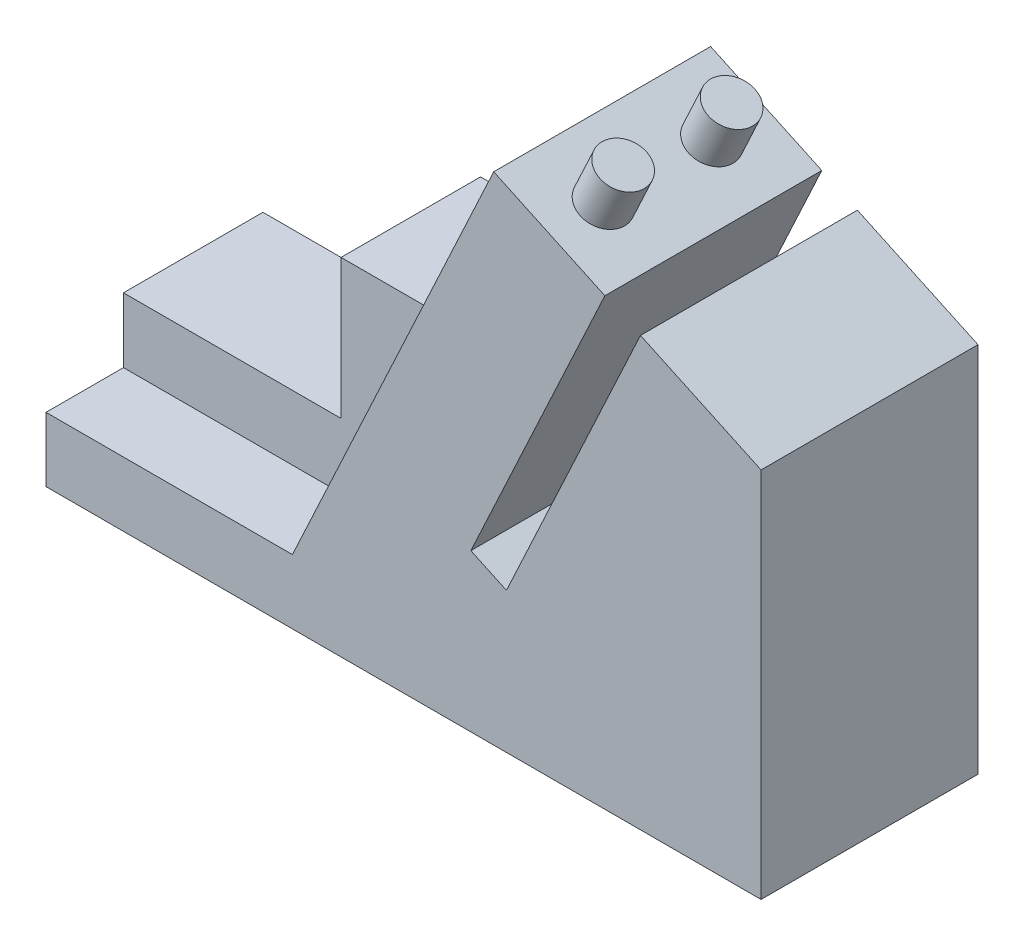
ISO-10303-21;
HEADER;
FILE_DESCRIPTION(('STEP AP214'),'2;1');
FILE_NAME('part.step','',(''),(''),'','','');
FILE_SCHEMA(('AUTOMOTIVE_DESIGN { 1 0 10303 214 1 1 1 1 }'));
ENDSEC;
DATA;
#1=APPLICATION_CONTEXT('core data for automotive mechanical design processes');
#2=APPLICATION_PROTOCOL_DEFINITION('international standard','automotive_design',2000,#1);
#3=PRODUCT_CONTEXT('',#1,'mechanical');
#4=PRODUCT('Part','Part','',(#3));
#5=PRODUCT_RELATED_PRODUCT_CATEGORY('part','',(#4));
#6=PRODUCT_DEFINITION_FORMATION('','',#4);
#7=PRODUCT_DEFINITION_CONTEXT('part definition',#1,'design');
#8=PRODUCT_DEFINITION('design','',#6,#7);
#9=PRODUCT_DEFINITION_SHAPE('','',#8);
#10=(LENGTH_UNIT() NAMED_UNIT(*) SI_UNIT(.MILLI.,.METRE.));
#11=(NAMED_UNIT(*) PLANE_ANGLE_UNIT() SI_UNIT($,.RADIAN.));
#12=(NAMED_UNIT(*) SI_UNIT($,.STERADIAN.) SOLID_ANGLE_UNIT());
#13=UNCERTAINTY_MEASURE_WITH_UNIT(LENGTH_MEASURE(1.E-05),#10,'distance_accuracy_value','');
#14=(GEOMETRIC_REPRESENTATION_CONTEXT(3) GLOBAL_UNCERTAINTY_ASSIGNED_CONTEXT((#13)) GLOBAL_UNIT_ASSIGNED_CONTEXT((#10,
#11,#12)) REPRESENTATION_CONTEXT('',''));
#15=CARTESIAN_POINT('',(0.,0.,0.));
#16=DIRECTION('',(0.,0.,1.));
#17=DIRECTION('',(1.,0.,0.));
#18=AXIS2_PLACEMENT_3D('',#15,#16,#17);
#19=CARTESIAN_POINT('',(-32008.7952704918,-8339.2597401296,28000.));
#20=DIRECTION('',(-1.,0.,0.));
#21=DIRECTION('',(0.,0.,1.));
#22=AXIS2_PLACEMENT_3D('',#19,#20,#21);
#23=PLANE('',#22);
#24=DIRECTION('',(0.,1.,0.));
#25=VECTOR('',#24,1.);
#26=CARTESIAN_POINT('',(-32008.7952704918,-8339.2597401296,0.));
#27=LINE('',#26,#25);
#28=CARTESIAN_POINT('',(-32008.7952704918,-8339.2597401296,0.));
#29=VERTEX_POINT('',#28);
#30=CARTESIAN_POINT('',(-32008.7952704918,8328.71220367922,0.));
#31=VERTEX_POINT('',#30);
#32=EDGE_CURVE('E183',#29,#31,#27,.T.);
#33=ORIENTED_EDGE('',*,*,#32,.F.);
#34=DIRECTION('',(0.,0.,-1.));
#35=VECTOR('',#34,1.);
#36=CARTESIAN_POINT('',(-32008.7952704918,-8339.2597401296,28000.));
#37=LINE('',#36,#35);
#38=CARTESIAN_POINT('',(-32008.7952704918,-8339.2597401296,28000.));
#39=VERTEX_POINT('',#38);
#40=EDGE_CURVE('E11',#39,#29,#37,.T.);
#41=ORIENTED_EDGE('',*,*,#40,.F.);
#42=DIRECTION('',(0.,1.,0.));
#43=VECTOR('',#42,1.);
#44=CARTESIAN_POINT('',(-32008.7952704918,-8339.2597401296,28000.));
#45=LINE('',#44,#43);
#46=CARTESIAN_POINT('',(-32008.7952704918,-32.960143442623,28000.));
#47=VERTEX_POINT('',#46);
#48=EDGE_CURVE('E188',#39,#47,#45,.T.);
#49=ORIENTED_EDGE('',*,*,#48,.T.);
#50=DIRECTION('',(0.,0.,-1.));
#51=VECTOR('',#50,1.);
#52=CARTESIAN_POINT('',(-32008.7952704918,-32.960143442623,28000.));
#53=LINE('',#52,#51);
#54=CARTESIAN_POINT('',(-32008.7952704918,-32.960143442623,18000.));
#55=VERTEX_POINT('',#54);
#56=EDGE_CURVE('E45',#47,#55,#53,.T.);
#57=ORIENTED_EDGE('',*,*,#56,.T.);
#58=DIRECTION('',(0.,-1.,0.));
#59=VECTOR('',#58,1.);
#60=CARTESIAN_POINT('',(-32008.7952704918,-32.960143442623,18000.));
#61=LINE('',#60,#59);
#62=CARTESIAN_POINT('',(-32008.7952704918,8328.71220367922,18000.));
#63=VERTEX_POINT('',#62);
#64=EDGE_CURVE('E154',#63,#55,#61,.T.);
#65=ORIENTED_EDGE('',*,*,#64,.F.);
#66=DIRECTION('',(0.,0.,-1.));
#67=VECTOR('',#66,1.);
#68=CARTESIAN_POINT('',(-32008.7952704918,8328.71220367922,18000.));
#69=LINE('',#68,#67);
#70=EDGE_CURVE('E173',#63,#31,#69,.T.);
#71=ORIENTED_EDGE('',*,*,#70,.T.);
#72=EDGE_LOOP('',(#33,#41,#49,#57,#65,#71));
#73=FACE_BOUND('',#72,.T.);
#74=ADVANCED_FACE('F39',(#73),#23,.T.);
#75=CARTESIAN_POINT('',(60289.5756714365,-8339.25974012959,28000.));
#76=DIRECTION('',(0.,-1.,0.));
#77=DIRECTION('',(1.,0.,0.));
#78=AXIS2_PLACEMENT_3D('',#75,#76,#77);
#79=PLANE('',#78);
#80=DIRECTION('',(-1.,0.,0.));
#81=VECTOR('',#80,1.);
#82=CARTESIAN_POINT('',(60289.5756714365,-8339.25974012959,0.));
#83=LINE('',#82,#81);
#84=CARTESIAN_POINT('',(60289.5756714365,-8339.25974012959,0.));
#85=VERTEX_POINT('',#84);
#86=EDGE_CURVE('E190',#85,#29,#83,.T.);
#87=ORIENTED_EDGE('',*,*,#86,.F.);
#88=DIRECTION('',(0.,0.,-1.));
#89=VECTOR('',#88,1.);
#90=CARTESIAN_POINT('',(60289.5756714365,-8339.25974012959,28000.));
#91=LINE('',#90,#89);
#92=CARTESIAN_POINT('',(60289.5756714365,-8339.25974012959,28000.));
#93=VERTEX_POINT('',#92);
#94=EDGE_CURVE('E50',#93,#85,#91,.T.);
#95=ORIENTED_EDGE('',*,*,#94,.F.);
#96=DIRECTION('',(-1.,0.,0.));
#97=VECTOR('',#96,1.);
#98=CARTESIAN_POINT('',(60289.5756714365,-8339.25974012959,28000.));
#99=LINE('',#98,#97);
#100=EDGE_CURVE('E211',#93,#39,#99,.T.);
#101=ORIENTED_EDGE('',*,*,#100,.T.);
#102=ORIENTED_EDGE('',*,*,#40,.T.);
#103=EDGE_LOOP('',(#87,#95,#101,#102));
#104=FACE_BOUND('',#103,.T.);
#105=ADVANCED_FACE('F299',(#104),#79,.T.);
#106=CARTESIAN_POINT('',(60289.5756714365,39678.8160946649,28000.));
#107=DIRECTION('',(1.,0.,0.));
#108=DIRECTION('',(0.,0.,-1.));
#109=AXIS2_PLACEMENT_3D('',#106,#107,#108);
#110=PLANE('',#109);
#111=DIRECTION('',(0.,-1.,0.));
#112=VECTOR('',#111,1.);
#113=CARTESIAN_POINT('',(60289.5756714365,39678.8160946649,0.));
#114=LINE('',#113,#112);
#115=CARTESIAN_POINT('',(60289.5756714365,39678.8160946649,0.));
#116=VERTEX_POINT('',#115);
#117=EDGE_CURVE('E235',#116,#85,#114,.T.);
#118=ORIENTED_EDGE('',*,*,#117,.F.);
#119=DIRECTION('',(0.,0.,-1.));
#120=VECTOR('',#119,1.);
#121=CARTESIAN_POINT('',(60289.5756714365,39678.8160946649,28000.));
#122=LINE('',#121,#120);
#123=CARTESIAN_POINT('',(60289.5756714365,39678.8160946649,28000.));
#124=VERTEX_POINT('',#123);
#125=EDGE_CURVE('E236',#124,#116,#122,.T.);
#126=ORIENTED_EDGE('',*,*,#125,.F.);
#127=DIRECTION('',(0.,-1.,0.));
#128=VECTOR('',#127,1.);
#129=CARTESIAN_POINT('',(60289.5756714365,39678.8160946649,28000.));
#130=LINE('',#129,#128);
#131=EDGE_CURVE('E208',#124,#93,#130,.T.);
#132=ORIENTED_EDGE('',*,*,#131,.T.);
#133=ORIENTED_EDGE('',*,*,#94,.T.);
#134=EDGE_LOOP('',(#118,#126,#132,#133));
#135=FACE_BOUND('',#134,.T.);
#136=ADVANCED_FACE('F294',(#135),#110,.T.);
#137=CARTESIAN_POINT('',(44721.8591466185,46929.5333801965,28000.));
#138=DIRECTION('',(0.422205539219614,0.906500128324467,0.));
#139=DIRECTION('',(-0.906500128324467,0.422205539219614,0.));
#140=AXIS2_PLACEMENT_3D('',#137,#138,#139);
#141=PLANE('',#140);
#142=DIRECTION('',(0.906500128324467,-0.422205539219614,0.));
#143=VECTOR('',#142,1.);
#144=CARTESIAN_POINT('',(44721.8591466185,46929.5333801965,0.));
#145=LINE('',#144,#143);
#146=CARTESIAN_POINT('',(44721.8591466185,46929.5333801965,0.));
#147=VERTEX_POINT('',#146);
#148=EDGE_CURVE('E230',#147,#116,#145,.T.);
#149=ORIENTED_EDGE('',*,*,#148,.F.);
#150=DIRECTION('',(0.,0.,-1.));
#151=VECTOR('',#150,1.);
#152=CARTESIAN_POINT('',(44721.8591466185,46929.5333801965,28000.));
#153=LINE('',#152,#151);
#154=CARTESIAN_POINT('',(44721.8591466185,46929.5333801965,28000.));
#155=VERTEX_POINT('',#154);
#156=EDGE_CURVE('E238',#155,#147,#153,.T.);
#157=ORIENTED_EDGE('',*,*,#156,.F.);
#158=DIRECTION('',(0.906500128324467,-0.422205539219614,0.));
#159=VECTOR('',#158,1.);
#160=CARTESIAN_POINT('',(44721.8591466185,46929.5333801965,28000.));
#161=LINE('',#160,#159);
#162=EDGE_CURVE('E202',#155,#124,#161,.T.);
#163=ORIENTED_EDGE('',*,*,#162,.T.);
#164=ORIENTED_EDGE('',*,*,#125,.T.);
#165=EDGE_LOOP('',(#149,#157,#163,#164));
#166=FACE_BOUND('',#165,.T.);
#167=ADVANCED_FACE('F288',(#166),#141,.T.);
#168=CARTESIAN_POINT('',(27422.0694741557,9785.86731873225,28000.));
#169=DIRECTION('',(-0.906500128324467,0.422205539219614,0.));
#170=DIRECTION('',(-0.422205539219614,-0.906500128324467,0.));
#171=AXIS2_PLACEMENT_3D('',#168,#169,#170);
#172=PLANE('',#171);
#173=DIRECTION('',(0.422205539219614,0.906500128324467,0.));
#174=VECTOR('',#173,1.);
#175=CARTESIAN_POINT('',(27422.0694741557,9785.86731873225,0.));
#176=LINE('',#175,#174);
#177=CARTESIAN_POINT('',(27422.0694741557,9785.86731873225,0.));
#178=VERTEX_POINT('',#177);
#179=EDGE_CURVE('E228',#178,#147,#176,.T.);
#180=ORIENTED_EDGE('',*,*,#179,.F.);
#181=DIRECTION('',(0.,0.,-1.));
#182=VECTOR('',#181,1.);
#183=CARTESIAN_POINT('',(27422.0694741557,9785.86731873225,28000.));
#184=LINE('',#183,#182);
#185=CARTESIAN_POINT('',(27422.0694741557,9785.86731873225,28000.));
#186=VERTEX_POINT('',#185);
#187=EDGE_CURVE('E244',#186,#178,#184,.T.);
#188=ORIENTED_EDGE('',*,*,#187,.F.);
#189=DIRECTION('',(0.422205539219614,0.906500128324467,0.));
#190=VECTOR('',#189,1.);
#191=CARTESIAN_POINT('',(27422.0694741557,9785.86731873225,28000.));
#192=LINE('',#191,#190);
#193=EDGE_CURVE('E205',#186,#155,#192,.T.);
#194=ORIENTED_EDGE('',*,*,#193,.T.);
#195=ORIENTED_EDGE('',*,*,#156,.T.);
#196=EDGE_LOOP('',(#180,#188,#194,#195));
#197=FACE_BOUND('',#196,.T.);
#198=ADVANCED_FACE('F290',(#197),#172,.T.);
#199=CARTESIAN_POINT('',(22828.6245587359,11925.2800190648,28000.));
#200=DIRECTION('',(0.422205539219615,0.906500128324467,0.));
#201=DIRECTION('',(-0.906500128324467,0.422205539219615,0.));
#202=AXIS2_PLACEMENT_3D('',#199,#200,#201);
#203=PLANE('',#202);
#204=DIRECTION('',(0.906500128324466,-0.422205539219615,0.));
#205=VECTOR('',#204,1.);
#206=CARTESIAN_POINT('',(22828.6245587359,11925.2800190648,0.));
#207=LINE('',#206,#205);
#208=CARTESIAN_POINT('',(22828.6245587359,11925.2800190648,0.));
#209=VERTEX_POINT('',#208);
#210=EDGE_CURVE('E224',#209,#178,#207,.T.);
#211=ORIENTED_EDGE('',*,*,#210,.F.);
#212=DIRECTION('',(0.,0.,-1.));
#213=VECTOR('',#212,1.);
#214=CARTESIAN_POINT('',(22828.6245587359,11925.2800190648,28000.));
#215=LINE('',#214,#213);
#216=CARTESIAN_POINT('',(22828.6245587359,11925.2800190648,28000.));
#217=VERTEX_POINT('',#216);
#218=EDGE_CURVE('E245',#217,#209,#215,.T.);
#219=ORIENTED_EDGE('',*,*,#218,.F.);
#220=DIRECTION('',(0.906500128324466,-0.422205539219615,0.));
#221=VECTOR('',#220,1.);
#222=CARTESIAN_POINT('',(22828.6245587359,11925.2800190648,28000.));
#223=LINE('',#222,#221);
#224=EDGE_CURVE('E200',#217,#186,#223,.T.);
#225=ORIENTED_EDGE('',*,*,#224,.T.);
#226=ORIENTED_EDGE('',*,*,#187,.T.);
#227=EDGE_LOOP('',(#211,#219,#225,#226));
#228=FACE_BOUND('',#227,.T.);
#229=ADVANCED_FACE('F282',(#228),#203,.T.);
#230=CARTESIAN_POINT('',(40128.4142311987,49068.946080529,28000.));
#231=DIRECTION('',(0.906500128324467,-0.422205539219615,0.));
#232=DIRECTION('',(0.422205539219615,0.906500128324467,0.));
#233=AXIS2_PLACEMENT_3D('',#230,#231,#232);
#234=PLANE('',#233);
#235=DIRECTION('',(-0.422205539219615,-0.906500128324466,0.));
#236=VECTOR('',#235,1.);
#237=CARTESIAN_POINT('',(40128.4142311987,49068.946080529,0.));
#238=LINE('',#237,#236);
#239=CARTESIAN_POINT('',(40128.4142311987,49068.946080529,0.));
#240=VERTEX_POINT('',#239);
#241=EDGE_CURVE('E219',#240,#209,#238,.T.);
#242=ORIENTED_EDGE('',*,*,#241,.F.);
#243=DIRECTION('',(0.,0.,-1.));
#244=VECTOR('',#243,1.);
#245=CARTESIAN_POINT('',(40128.4142311987,49068.946080529,28000.));
#246=LINE('',#245,#244);
#247=CARTESIAN_POINT('',(40128.4142311987,49068.946080529,28000.));
#248=VERTEX_POINT('',#247);
#249=EDGE_CURVE('E247',#248,#240,#246,.T.);
#250=ORIENTED_EDGE('',*,*,#249,.F.);
#251=DIRECTION('',(-0.422205539219615,-0.906500128324466,0.));
#252=VECTOR('',#251,1.);
#253=CARTESIAN_POINT('',(40128.4142311987,49068.946080529,28000.));
#254=LINE('',#253,#252);
#255=EDGE_CURVE('E198',#248,#217,#254,.T.);
#256=ORIENTED_EDGE('',*,*,#255,.T.);
#257=ORIENTED_EDGE('',*,*,#218,.T.);
#258=EDGE_LOOP('',(#242,#250,#256,#257));
#259=FACE_BOUND('',#258,.T.);
#260=ADVANCED_FACE('F278',(#259),#234,.T.);
#261=CARTESIAN_POINT('',(25778.6941642917,55752.3773445679,28000.));
#262=DIRECTION('',(0.422205539219614,0.906500128324467,0.));
#263=DIRECTION('',(-0.906500128324467,0.422205539219614,0.));
#264=AXIS2_PLACEMENT_3D('',#261,#262,#263);
#265=PLANE('',#264);
#266=CARTESIAN_POINT('',(32953.5541977452,52410.6617125485,21000.));
#267=DIRECTION('',(0.422205539219614,0.906500128324467,0.));
#268=DIRECTION('',(-0.906500128324467,0.422205539219614,0.));
#269=AXIS2_PLACEMENT_3D('',#266,#267,#268);
#270=CIRCLE('',#269,3000.);
#271=CARTESIAN_POINT('',(30234.0538127718,53677.2783302073,21000.));
#272=VERTEX_POINT('',#271);
#273=EDGE_CURVE('E351',#272,#272,#270,.T.);
#274=ORIENTED_EDGE('',*,*,#273,.F.);
#275=EDGE_LOOP('',(#274));
#276=FACE_BOUND('',#275,.T.);
#277=CARTESIAN_POINT('',(32953.5541977452,52410.6617125485,7000.));
#278=DIRECTION('',(0.422205539219614,0.906500128324467,0.));
#279=DIRECTION('',(-0.906500128324467,0.422205539219614,0.));
#280=AXIS2_PLACEMENT_3D('',#277,#278,#279);
#281=CIRCLE('',#280,3000.);
#282=CARTESIAN_POINT('',(30234.0538127718,53677.2783302073,7000.));
#283=VERTEX_POINT('',#282);
#284=EDGE_CURVE('E359',#283,#283,#281,.T.);
#285=ORIENTED_EDGE('',*,*,#284,.F.);
#286=EDGE_LOOP('',(#285));
#287=FACE_BOUND('',#286,.T.);
#288=DIRECTION('',(0.906500128324467,-0.422205539219614,0.));
#289=VECTOR('',#288,1.);
#290=CARTESIAN_POINT('',(25778.6941642917,55752.3773445679,0.));
#291=LINE('',#290,#289);
#292=CARTESIAN_POINT('',(25778.6941642917,55752.3773445679,0.));
#293=VERTEX_POINT('',#292);
#294=EDGE_CURVE('E220',#293,#240,#291,.T.);
#295=ORIENTED_EDGE('',*,*,#294,.F.);
#296=DIRECTION('',(0.,0.,-1.));
#297=VECTOR('',#296,1.);
#298=CARTESIAN_POINT('',(25778.6941642917,55752.3773445679,28000.));
#299=LINE('',#298,#297);
#300=CARTESIAN_POINT('',(25778.6941642917,55752.3773445679,28000.));
#301=VERTEX_POINT('',#300);
#302=EDGE_CURVE('E144',#301,#293,#299,.T.);
#303=ORIENTED_EDGE('',*,*,#302,.F.);
#304=DIRECTION('',(0.906500128324467,-0.422205539219614,0.));
#305=VECTOR('',#304,1.);
#306=CARTESIAN_POINT('',(25778.6941642917,55752.3773445679,28000.));
#307=LINE('',#306,#305);
#308=EDGE_CURVE('E194',#301,#248,#307,.T.);
#309=ORIENTED_EDGE('',*,*,#308,.T.);
#310=ORIENTED_EDGE('',*,*,#249,.T.);
#311=EDGE_LOOP('',(#295,#303,#309,#310));
#312=FACE_BOUND('',#311,.T.);
#313=ADVANCED_FACE('F252',(#276,#287,#312),#265,.T.);
#314=CARTESIAN_POINT('',(-203.51781642551,-32.960143442623,28000.));
#315=DIRECTION('',(-0.906500128324467,0.422205539219614,0.));
#316=DIRECTION('',(-0.422205539219614,-0.906500128324467,0.));
#317=AXIS2_PLACEMENT_3D('',#314,#315,#316);
#318=PLANE('',#317);
#319=DIRECTION('',(0.,0.,-1.));
#320=VECTOR('',#319,1.);
#321=CARTESIAN_POINT('',(12074.5213589463,26328.7122036792,18000.));
#322=LINE('',#321,#320);
#323=CARTESIAN_POINT('',(12074.5213589463,26328.7122036792,18000.));
#324=VERTEX_POINT('',#323);
#325=CARTESIAN_POINT('',(12074.5213589463,26328.7122036792,0.));
#326=VERTEX_POINT('',#325);
#327=EDGE_CURVE('E54',#324,#326,#322,.T.);
#328=ORIENTED_EDGE('',*,*,#327,.F.);
#329=DIRECTION('',(0.422205539219614,0.906500128324467,0.));
#330=VECTOR('',#329,1.);
#331=CARTESIAN_POINT('',(-203.51781642551,-32.960143442623,18000.));
#332=LINE('',#331,#330);
#333=CARTESIAN_POINT('',(-203.51781642551,-32.960143442623,18000.));
#334=VERTEX_POINT('',#333);
#335=EDGE_CURVE('E148',#334,#324,#332,.T.);
#336=ORIENTED_EDGE('',*,*,#335,.F.);
#337=DIRECTION('',(0.,0.,-1.));
#338=VECTOR('',#337,1.);
#339=CARTESIAN_POINT('',(-203.51781642551,-32.960143442623,28000.));
#340=LINE('',#339,#338);
#341=CARTESIAN_POINT('',(-203.51781642551,-32.960143442623,28000.));
#342=VERTEX_POINT('',#341);
#343=EDGE_CURVE('E136',#342,#334,#340,.T.);
#344=ORIENTED_EDGE('',*,*,#343,.F.);
#345=DIRECTION('',(0.422205539219614,0.906500128324467,0.));
#346=VECTOR('',#345,1.);
#347=CARTESIAN_POINT('',(-203.51781642551,-32.960143442623,28000.));
#348=LINE('',#347,#346);
#349=EDGE_CURVE('E192',#342,#301,#348,.T.);
#350=ORIENTED_EDGE('',*,*,#349,.T.);
#351=ORIENTED_EDGE('',*,*,#302,.T.);
#352=DIRECTION('',(0.422205539219614,0.906500128324467,0.));
#353=VECTOR('',#352,1.);
#354=CARTESIAN_POINT('',(-203.51781642551,-32.960143442623,0.));
#355=LINE('',#354,#353);
#356=EDGE_CURVE('E214',#326,#293,#355,.T.);
#357=ORIENTED_EDGE('',*,*,#356,.F.);
#358=EDGE_LOOP('',(#328,#336,#344,#350,#351,#357));
#359=FACE_BOUND('',#358,.T.);
#360=ADVANCED_FACE('F150',(#359),#318,.T.);
#361=CARTESIAN_POINT('',(-32008.7952704918,-32.960143442623,28000.));
#362=DIRECTION('',(0.,1.,0.));
#363=DIRECTION('',(0.,0.,1.));
#364=AXIS2_PLACEMENT_3D('',#361,#362,#363);
#365=PLANE('',#364);
#366=DIRECTION('',(1.,0.,0.));
#367=VECTOR('',#366,1.);
#368=CARTESIAN_POINT('',(-32008.7952704918,-32.960143442623,18000.));
#369=LINE('',#368,#367);
#370=EDGE_CURVE('E62',#55,#334,#369,.T.);
#371=ORIENTED_EDGE('',*,*,#370,.F.);
#372=ORIENTED_EDGE('',*,*,#56,.F.);
#373=DIRECTION('',(1.,0.,0.));
#374=VECTOR('',#373,1.);
#375=CARTESIAN_POINT('',(-32008.7952704918,-32.960143442623,28000.));
#376=LINE('',#375,#374);
#377=EDGE_CURVE('E142',#47,#342,#376,.T.);
#378=ORIENTED_EDGE('',*,*,#377,.T.);
#379=ORIENTED_EDGE('',*,*,#343,.T.);
#380=EDGE_LOOP('',(#371,#372,#378,#379));
#381=FACE_BOUND('',#380,.T.);
#382=ADVANCED_FACE('F138',(#381),#365,.T.);
#383=CARTESIAN_POINT('',(0.,0.,28000.));
#384=DIRECTION('',(0.,0.,-1.));
#385=DIRECTION('',(-1.,0.,0.));
#386=AXIS2_PLACEMENT_3D('',#383,#384,#385);
#387=PLANE('',#386);
#388=ORIENTED_EDGE('',*,*,#48,.F.);
#389=ORIENTED_EDGE('',*,*,#100,.F.);
#390=ORIENTED_EDGE('',*,*,#131,.F.);
#391=ORIENTED_EDGE('',*,*,#162,.F.);
#392=ORIENTED_EDGE('',*,*,#193,.F.);
#393=ORIENTED_EDGE('',*,*,#224,.F.);
#394=ORIENTED_EDGE('',*,*,#255,.F.);
#395=ORIENTED_EDGE('',*,*,#308,.F.);
#396=ORIENTED_EDGE('',*,*,#349,.F.);
#397=ORIENTED_EDGE('',*,*,#377,.F.);
#398=EDGE_LOOP('',(#388,#389,#390,#391,#392,#393,#394,#395,#396,#397));
#399=FACE_BOUND('',#398,.T.);
#400=ADVANCED_FACE('F273',(#399),#387,.F.);
#401=CARTESIAN_POINT('',(0.,0.,0.));
#402=DIRECTION('',(0.,0.,-1.));
#403=DIRECTION('',(-1.,0.,0.));
#404=AXIS2_PLACEMENT_3D('',#401,#402,#403);
#405=PLANE('',#404);
#406=DIRECTION('',(-1.,0.,0.));
#407=VECTOR('',#406,1.);
#408=CARTESIAN_POINT('',(-3925.47864105371,26328.7122036792,0.));
#409=LINE('',#408,#407);
#410=CARTESIAN_POINT('',(-3925.47864105371,26328.7122036792,0.));
#411=VERTEX_POINT('',#410);
#412=EDGE_CURVE('E174',#326,#411,#409,.T.);
#413=ORIENTED_EDGE('',*,*,#412,.F.);
#414=ORIENTED_EDGE('',*,*,#356,.T.);
#415=ORIENTED_EDGE('',*,*,#294,.T.);
#416=ORIENTED_EDGE('',*,*,#241,.T.);
#417=ORIENTED_EDGE('',*,*,#210,.T.);
#418=ORIENTED_EDGE('',*,*,#179,.T.);
#419=ORIENTED_EDGE('',*,*,#148,.T.);
#420=ORIENTED_EDGE('',*,*,#117,.T.);
#421=ORIENTED_EDGE('',*,*,#86,.T.);
#422=ORIENTED_EDGE('',*,*,#32,.T.);
#423=DIRECTION('',(-1.,0.,0.));
#424=VECTOR('',#423,1.);
#425=CARTESIAN_POINT('',(-32008.7952704918,8328.71220367922,0.));
#426=LINE('',#425,#424);
#427=CARTESIAN_POINT('',(-3925.47864105371,8328.71220367922,0.));
#428=VERTEX_POINT('',#427);
#429=EDGE_CURVE('E156',#428,#31,#426,.T.);
#430=ORIENTED_EDGE('',*,*,#429,.F.);
#431=DIRECTION('',(0.,-1.,0.));
#432=VECTOR('',#431,1.);
#433=CARTESIAN_POINT('',(-3925.47864105371,8328.71220367922,0.));
#434=LINE('',#433,#432);
#435=EDGE_CURVE('E157',#411,#428,#434,.T.);
#436=ORIENTED_EDGE('',*,*,#435,.F.);
#437=EDGE_LOOP('',(#413,#414,#415,#416,#417,#418,#419,#420,#421,#422,#430,#436));
#438=FACE_BOUND('',#437,.T.);
#439=ADVANCED_FACE('F258',(#438),#405,.T.);
#440=CARTESIAN_POINT('',(-3925.47864105371,26328.7122036792,18000.));
#441=DIRECTION('',(0.,-1.,0.));
#442=DIRECTION('',(0.,0.,-1.));
#443=AXIS2_PLACEMENT_3D('',#440,#441,#442);
#444=PLANE('',#443);
#445=ORIENTED_EDGE('',*,*,#412,.T.);
#446=DIRECTION('',(0.,0.,-1.));
#447=VECTOR('',#446,1.);
#448=CARTESIAN_POINT('',(-3925.47864105371,26328.7122036792,18000.));
#449=LINE('',#448,#447);
#450=CARTESIAN_POINT('',(-3925.47864105371,26328.7122036792,18000.));
#451=VERTEX_POINT('',#450);
#452=EDGE_CURVE('E182',#451,#411,#449,.T.);
#453=ORIENTED_EDGE('',*,*,#452,.F.);
#454=DIRECTION('',(-1.,0.,0.));
#455=VECTOR('',#454,1.);
#456=CARTESIAN_POINT('',(-3925.47864105371,26328.7122036792,18000.));
#457=LINE('',#456,#455);
#458=EDGE_CURVE('E147',#324,#451,#457,.T.);
#459=ORIENTED_EDGE('',*,*,#458,.F.);
#460=ORIENTED_EDGE('',*,*,#327,.T.);
#461=EDGE_LOOP('',(#445,#453,#459,#460));
#462=FACE_BOUND('',#461,.T.);
#463=ADVANCED_FACE('F261',(#462),#444,.F.);
#464=CARTESIAN_POINT('',(-3925.47864105371,8328.71220367922,18000.));
#465=DIRECTION('',(1.,0.,0.));
#466=DIRECTION('',(0.,1.,0.));
#467=AXIS2_PLACEMENT_3D('',#464,#465,#466);
#468=PLANE('',#467);
#469=ORIENTED_EDGE('',*,*,#435,.T.);
#470=DIRECTION('',(0.,0.,-1.));
#471=VECTOR('',#470,1.);
#472=CARTESIAN_POINT('',(-3925.47864105371,8328.71220367922,18000.));
#473=LINE('',#472,#471);
#474=CARTESIAN_POINT('',(-3925.47864105371,8328.71220367922,18000.));
#475=VERTEX_POINT('',#474);
#476=EDGE_CURVE('E179',#475,#428,#473,.T.);
#477=ORIENTED_EDGE('',*,*,#476,.F.);
#478=DIRECTION('',(0.,-1.,0.));
#479=VECTOR('',#478,1.);
#480=CARTESIAN_POINT('',(-3925.47864105371,8328.71220367922,18000.));
#481=LINE('',#480,#479);
#482=EDGE_CURVE('E167',#451,#475,#481,.T.);
#483=ORIENTED_EDGE('',*,*,#482,.F.);
#484=ORIENTED_EDGE('',*,*,#452,.T.);
#485=EDGE_LOOP('',(#469,#477,#483,#484));
#486=FACE_BOUND('',#485,.T.);
#487=ADVANCED_FACE('F262',(#486),#468,.F.);
#488=CARTESIAN_POINT('',(-32008.7952704918,8328.71220367922,18000.));
#489=DIRECTION('',(0.,-1.,0.));
#490=DIRECTION('',(0.,0.,-1.));
#491=AXIS2_PLACEMENT_3D('',#488,#489,#490);
#492=PLANE('',#491);
#493=ORIENTED_EDGE('',*,*,#429,.T.);
#494=ORIENTED_EDGE('',*,*,#70,.F.);
#495=DIRECTION('',(-1.,0.,0.));
#496=VECTOR('',#495,1.);
#497=CARTESIAN_POINT('',(-32008.7952704918,8328.71220367922,18000.));
#498=LINE('',#497,#496);
#499=EDGE_CURVE('E169',#475,#63,#498,.T.);
#500=ORIENTED_EDGE('',*,*,#499,.F.);
#501=ORIENTED_EDGE('',*,*,#476,.T.);
#502=EDGE_LOOP('',(#493,#494,#500,#501));
#503=FACE_BOUND('',#502,.T.);
#504=ADVANCED_FACE('F267',(#503),#492,.F.);
#505=CARTESIAN_POINT('',(0.,0.,18000.));
#506=DIRECTION('',(0.,0.,1.));
#507=DIRECTION('',(1.,0.,0.));
#508=AXIS2_PLACEMENT_3D('',#505,#506,#507);
#509=PLANE('',#508);
#510=ORIENTED_EDGE('',*,*,#370,.T.);
#511=ORIENTED_EDGE('',*,*,#335,.T.);
#512=ORIENTED_EDGE('',*,*,#458,.T.);
#513=ORIENTED_EDGE('',*,*,#482,.T.);
#514=ORIENTED_EDGE('',*,*,#499,.T.);
#515=ORIENTED_EDGE('',*,*,#64,.T.);
#516=EDGE_LOOP('',(#510,#511,#512,#513,#514,#515));
#517=FACE_BOUND('',#516,.T.);
#518=ADVANCED_FACE('F153',(#517),#509,.T.);
#519=CARTESIAN_POINT('',(35486.7874330629,57849.6624824953,7000.));
#520=DIRECTION('',(-0.422205539219614,-0.906500128324467,0.));
#521=DIRECTION('',(0.906500128324467,-0.422205539219614,0.));
#522=AXIS2_PLACEMENT_3D('',#519,#520,#521);
#523=CYLINDRICAL_SURFACE('',#522,3000.);
#524=CARTESIAN_POINT('',(35486.7874330629,57849.6624824953,7000.));
#525=DIRECTION('',(0.422205539219614,0.906500128324467,0.));
#526=DIRECTION('',(-0.906500128324467,0.422205539219614,0.));
#527=AXIS2_PLACEMENT_3D('',#524,#525,#526);
#528=CIRCLE('',#527,3000.);
#529=CARTESIAN_POINT('',(32767.2870480895,59116.2791001541,7000.));
#530=VERTEX_POINT('',#529);
#531=EDGE_CURVE('E165',#530,#530,#528,.T.);
#532=ORIENTED_EDGE('',*,*,#531,.F.);
#533=EDGE_LOOP('',(#532));
#534=FACE_BOUND('',#533,.T.);
#535=ORIENTED_EDGE('',*,*,#284,.T.);
#536=EDGE_LOOP('',(#535));
#537=FACE_BOUND('',#536,.T.);
#538=ADVANCED_FACE('F338',(#534,#537),#523,.T.);
#539=CARTESIAN_POINT('',(35486.7874330629,57849.6624824953,7000.));
#540=DIRECTION('',(0.422205539219614,0.906500128324467,0.));
#541=DIRECTION('',(-0.906500128324467,0.422205539219614,0.));
#542=AXIS2_PLACEMENT_3D('',#539,#540,#541);
#543=PLANE('',#542);
#544=ORIENTED_EDGE('',*,*,#531,.T.);
#545=EDGE_LOOP('',(#544));
#546=FACE_BOUND('',#545,.T.);
#547=ADVANCED_FACE('F339',(#546),#543,.T.);
#548=CARTESIAN_POINT('',(35486.7874330629,57849.6624824953,21000.));
#549=DIRECTION('',(-0.422205539219614,-0.906500128324467,0.));
#550=DIRECTION('',(0.906500128324467,-0.422205539219614,0.));
#551=AXIS2_PLACEMENT_3D('',#548,#549,#550);
#552=CYLINDRICAL_SURFACE('',#551,3000.);
#553=CARTESIAN_POINT('',(35486.7874330629,57849.6624824953,21000.));
#554=DIRECTION('',(0.422205539219614,0.906500128324467,0.));
#555=DIRECTION('',(-0.906500128324467,0.422205539219614,0.));
#556=AXIS2_PLACEMENT_3D('',#553,#554,#555);
#557=CIRCLE('',#556,3000.);
#558=CARTESIAN_POINT('',(32767.2870480895,59116.2791001541,21000.));
#559=VERTEX_POINT('',#558);
#560=EDGE_CURVE('E175',#559,#559,#557,.T.);
#561=ORIENTED_EDGE('',*,*,#560,.F.);
#562=EDGE_LOOP('',(#561));
#563=FACE_BOUND('',#562,.T.);
#564=ORIENTED_EDGE('',*,*,#273,.T.);
#565=EDGE_LOOP('',(#564));
#566=FACE_BOUND('',#565,.T.);
#567=ADVANCED_FACE('F336',(#563,#566),#552,.T.);
#568=CARTESIAN_POINT('',(35486.7874330629,57849.6624824953,21000.));
#569=DIRECTION('',(0.422205539219614,0.906500128324467,0.));
#570=DIRECTION('',(-0.906500128324467,0.422205539219614,0.));
#571=AXIS2_PLACEMENT_3D('',#568,#569,#570);
#572=PLANE('',#571);
#573=ORIENTED_EDGE('',*,*,#560,.T.);
#574=EDGE_LOOP('',(#573));
#575=FACE_BOUND('',#574,.T.);
#576=ADVANCED_FACE('F350',(#575),#572,.T.);
#577=CLOSED_SHELL('',(#74,#105,#136,#167,#198,#229,#260,#313,#360,#382,#400,#439,#463,#487,#504,
#518,#538,#547,#567,#576));
#578=MANIFOLD_SOLID_BREP('B2',#577);
#579=ADVANCED_BREP_SHAPE_REPRESENTATION('',(#18,#578),#14);
#580=SHAPE_DEFINITION_REPRESENTATION(#9,#579);
ENDSEC;
END-ISO-10303-21;
